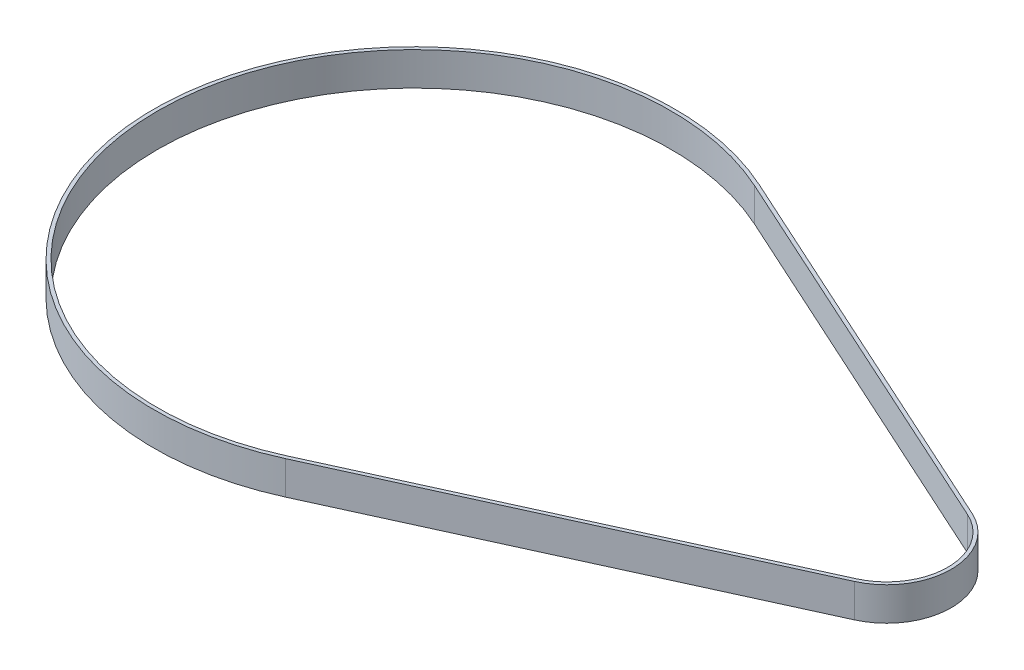
ISO-10303-21;
HEADER;
FILE_DESCRIPTION(('STEP AP214'),'2;1');
FILE_NAME('part.step','',(''),(''),'','','');
FILE_SCHEMA(('AUTOMOTIVE_DESIGN { 1 0 10303 214 1 1 1 1 }'));
ENDSEC;
DATA;
#1=APPLICATION_CONTEXT('core data for automotive mechanical design processes');
#2=APPLICATION_PROTOCOL_DEFINITION('international standard','automotive_design',2000,#1);
#3=PRODUCT_CONTEXT('',#1,'mechanical');
#4=PRODUCT('Part','Part','',(#3));
#5=PRODUCT_RELATED_PRODUCT_CATEGORY('part','',(#4));
#6=PRODUCT_DEFINITION_FORMATION('','',#4);
#7=PRODUCT_DEFINITION_CONTEXT('part definition',#1,'design');
#8=PRODUCT_DEFINITION('design','',#6,#7);
#9=PRODUCT_DEFINITION_SHAPE('','',#8);
#10=(LENGTH_UNIT() NAMED_UNIT(*) SI_UNIT(.MILLI.,.METRE.));
#11=(NAMED_UNIT(*) PLANE_ANGLE_UNIT() SI_UNIT($,.RADIAN.));
#12=(NAMED_UNIT(*) SI_UNIT($,.STERADIAN.) SOLID_ANGLE_UNIT());
#13=UNCERTAINTY_MEASURE_WITH_UNIT(LENGTH_MEASURE(1.E-05),#10,'distance_accuracy_value','');
#14=(GEOMETRIC_REPRESENTATION_CONTEXT(3) GLOBAL_UNCERTAINTY_ASSIGNED_CONTEXT((#13)) GLOBAL_UNIT_ASSIGNED_CONTEXT((#10,
#11,#12)) REPRESENTATION_CONTEXT('',''));
#15=CARTESIAN_POINT('',(0.,0.,0.));
#16=DIRECTION('',(0.,0.,1.));
#17=DIRECTION('',(1.,0.,0.));
#18=AXIS2_PLACEMENT_3D('',#15,#16,#17);
#19=CARTESIAN_POINT('',(0.,3.,0.));
#20=DIRECTION('',(0.,1.,0.));
#21=DIRECTION('',(0.,0.,1.));
#22=AXIS2_PLACEMENT_3D('',#19,#20,#21);
#23=PLANE('',#22);
#24=CARTESIAN_POINT('',(0.,3.,0.));
#25=DIRECTION('',(0.,1.,0.));
#26=DIRECTION('',(0.,0.,1.));
#27=AXIS2_PLACEMENT_3D('',#24,#25,#26);
#28=CIRCLE('',#27,46.88);
#29=CARTESIAN_POINT('',(19.4414117647059,3.,-42.6587143335937));
#30=VERTEX_POINT('',#29);
#31=CARTESIAN_POINT('',(19.4414117647059,3.,42.6587143335937));
#32=VERTEX_POINT('',#31);
#33=EDGE_CURVE('E138',#30,#32,#28,.T.);
#34=ORIENTED_EDGE('',*,*,#33,.T.);
#35=DIRECTION('',(0.909955510528877,0.,-0.414705882352941));
#36=VECTOR('',#35,1.);
#37=CARTESIAN_POINT('',(19.4414117647059,3.,42.6587143335937));
#38=LINE('',#37,#36);
#39=CARTESIAN_POINT('',(89.8230294117647,3.,10.5827825874508));
#40=VERTEX_POINT('',#39);
#41=EDGE_CURVE('E141',#32,#40,#38,.T.);
#42=ORIENTED_EDGE('',*,*,#41,.T.);
#43=CARTESIAN_POINT('',(85.,3.,0.));
#44=DIRECTION('',(0.,1.,0.));
#45=DIRECTION('',(0.,0.,1.));
#46=AXIS2_PLACEMENT_3D('',#43,#44,#45);
#47=CIRCLE('',#46,11.63);
#48=CARTESIAN_POINT('',(89.8230294117647,3.,-10.5827825874508));
#49=VERTEX_POINT('',#48);
#50=EDGE_CURVE('E144',#40,#49,#47,.T.);
#51=ORIENTED_EDGE('',*,*,#50,.T.);
#52=DIRECTION('',(-0.909955510528877,0.,-0.414705882352941));
#53=VECTOR('',#52,1.);
#54=CARTESIAN_POINT('',(89.8230294117647,3.,-10.5827825874508));
#55=LINE('',#54,#53);
#56=EDGE_CURVE('E146',#49,#30,#55,.T.);
#57=ORIENTED_EDGE('',*,*,#56,.T.);
#58=EDGE_LOOP('',(#34,#42,#51,#57));
#59=FACE_BOUND('',#58,.T.);
#60=DIRECTION('',(-0.909955510528877,0.,-0.414705882352941));
#61=VECTOR('',#60,1.);
#62=CARTESIAN_POINT('',(89.5617647058824,3.,-10.0095106158176));
#63=LINE('',#62,#61);
#64=CARTESIAN_POINT('',(89.5617647058824,3.,-10.0095106158176));
#65=VERTEX_POINT('',#64);
#66=CARTESIAN_POINT('',(19.1801470588235,3.,-42.0854423619605));
#67=VERTEX_POINT('',#66);
#68=EDGE_CURVE('E110',#65,#67,#63,.T.);
#69=ORIENTED_EDGE('',*,*,#68,.F.);
#70=CARTESIAN_POINT('',(85.,3.,0.));
#71=DIRECTION('',(0.,1.,0.));
#72=DIRECTION('',(0.,0.,1.));
#73=AXIS2_PLACEMENT_3D('',#70,#71,#72);
#74=CIRCLE('',#73,11.);
#75=CARTESIAN_POINT('',(89.5617647058824,3.,10.0095106158176));
#76=VERTEX_POINT('',#75);
#77=EDGE_CURVE('E102',#76,#65,#74,.T.);
#78=ORIENTED_EDGE('',*,*,#77,.F.);
#79=DIRECTION('',(0.909955510528877,0.,-0.414705882352941));
#80=VECTOR('',#79,1.);
#81=CARTESIAN_POINT('',(19.1801470588235,3.,42.0854423619605));
#82=LINE('',#81,#80);
#83=CARTESIAN_POINT('',(19.1801470588235,3.,42.0854423619605));
#84=VERTEX_POINT('',#83);
#85=EDGE_CURVE('E124',#84,#76,#82,.T.);
#86=ORIENTED_EDGE('',*,*,#85,.F.);
#87=CARTESIAN_POINT('',(0.,3.,0.));
#88=DIRECTION('',(0.,1.,0.));
#89=DIRECTION('',(0.,0.,1.));
#90=AXIS2_PLACEMENT_3D('',#87,#88,#89);
#91=CIRCLE('',#90,46.25);
#92=EDGE_CURVE('E122',#67,#84,#91,.T.);
#93=ORIENTED_EDGE('',*,*,#92,.F.);
#94=EDGE_LOOP('',(#69,#78,#86,#93));
#95=FACE_BOUND('',#94,.T.);
#96=ADVANCED_FACE('F37',(#59,#95),#23,.T.);
#97=CARTESIAN_POINT('',(0.,-3.,0.));
#98=DIRECTION('',(0.,1.,0.));
#99=DIRECTION('',(0.,0.,1.));
#100=AXIS2_PLACEMENT_3D('',#97,#98,#99);
#101=PLANE('',#100);
#102=CARTESIAN_POINT('',(0.,-3.,0.));
#103=DIRECTION('',(0.,1.,0.));
#104=DIRECTION('',(0.,0.,1.));
#105=AXIS2_PLACEMENT_3D('',#102,#103,#104);
#106=CIRCLE('',#105,46.88);
#107=CARTESIAN_POINT('',(19.4414117647059,-3.,-42.6587143335937));
#108=VERTEX_POINT('',#107);
#109=CARTESIAN_POINT('',(19.4414117647059,-3.,42.6587143335937));
#110=VERTEX_POINT('',#109);
#111=EDGE_CURVE('E118',#108,#110,#106,.T.);
#112=ORIENTED_EDGE('',*,*,#111,.F.);
#113=DIRECTION('',(-0.909955510528877,0.,-0.414705882352941));
#114=VECTOR('',#113,1.);
#115=CARTESIAN_POINT('',(89.8230294117647,-3.,-10.5827825874508));
#116=LINE('',#115,#114);
#117=CARTESIAN_POINT('',(89.8230294117647,-3.,-10.5827825874508));
#118=VERTEX_POINT('',#117);
#119=EDGE_CURVE('E142',#118,#108,#116,.T.);
#120=ORIENTED_EDGE('',*,*,#119,.F.);
#121=CARTESIAN_POINT('',(85.,-3.,0.));
#122=DIRECTION('',(0.,1.,0.));
#123=DIRECTION('',(0.,0.,1.));
#124=AXIS2_PLACEMENT_3D('',#121,#122,#123);
#125=CIRCLE('',#124,11.63);
#126=CARTESIAN_POINT('',(89.8230294117647,-3.,10.5827825874508));
#127=VERTEX_POINT('',#126);
#128=EDGE_CURVE('E153',#127,#118,#125,.T.);
#129=ORIENTED_EDGE('',*,*,#128,.F.);
#130=DIRECTION('',(0.909955510528877,0.,-0.414705882352941));
#131=VECTOR('',#130,1.);
#132=CARTESIAN_POINT('',(19.4414117647059,-3.,42.6587143335937));
#133=LINE('',#132,#131);
#134=EDGE_CURVE('E151',#110,#127,#133,.T.);
#135=ORIENTED_EDGE('',*,*,#134,.F.);
#136=EDGE_LOOP('',(#112,#120,#129,#135));
#137=FACE_BOUND('',#136,.T.);
#138=CARTESIAN_POINT('',(85.,-3.,0.));
#139=DIRECTION('',(0.,1.,0.));
#140=DIRECTION('',(0.,0.,1.));
#141=AXIS2_PLACEMENT_3D('',#138,#139,#140);
#142=CIRCLE('',#141,11.);
#143=CARTESIAN_POINT('',(89.5617647058824,-3.,10.0095106158176));
#144=VERTEX_POINT('',#143);
#145=CARTESIAN_POINT('',(89.5617647058824,-3.,-10.0095106158176));
#146=VERTEX_POINT('',#145);
#147=EDGE_CURVE('E60',#144,#146,#142,.T.);
#148=ORIENTED_EDGE('',*,*,#147,.T.);
#149=DIRECTION('',(-0.909955510528877,0.,-0.414705882352941));
#150=VECTOR('',#149,1.);
#151=CARTESIAN_POINT('',(89.5617647058824,-3.,-10.0095106158176));
#152=LINE('',#151,#150);
#153=CARTESIAN_POINT('',(19.1801470588235,-3.,-42.0854423619605));
#154=VERTEX_POINT('',#153);
#155=EDGE_CURVE('E117',#146,#154,#152,.T.);
#156=ORIENTED_EDGE('',*,*,#155,.T.);
#157=CARTESIAN_POINT('',(0.,-3.,0.));
#158=DIRECTION('',(0.,1.,0.));
#159=DIRECTION('',(0.,0.,1.));
#160=AXIS2_PLACEMENT_3D('',#157,#158,#159);
#161=CIRCLE('',#160,46.25);
#162=CARTESIAN_POINT('',(19.1801470588235,-3.,42.0854423619605));
#163=VERTEX_POINT('',#162);
#164=EDGE_CURVE('E130',#154,#163,#161,.T.);
#165=ORIENTED_EDGE('',*,*,#164,.T.);
#166=DIRECTION('',(0.909955510528877,0.,-0.414705882352941));
#167=VECTOR('',#166,1.);
#168=CARTESIAN_POINT('',(19.1801470588235,-3.,42.0854423619605));
#169=LINE('',#168,#167);
#170=EDGE_CURVE('E111',#163,#144,#169,.T.);
#171=ORIENTED_EDGE('',*,*,#170,.T.);
#172=EDGE_LOOP('',(#148,#156,#165,#171));
#173=FACE_BOUND('',#172,.T.);
#174=ADVANCED_FACE('F171',(#137,#173),#101,.F.);
#175=CARTESIAN_POINT('',(0.,3.,0.));
#176=DIRECTION('',(0.,-1.,0.));
#177=DIRECTION('',(0.,0.,-1.));
#178=AXIS2_PLACEMENT_3D('',#175,#176,#177);
#179=CYLINDRICAL_SURFACE('',#178,46.88);
#180=ORIENTED_EDGE('',*,*,#111,.T.);
#181=DIRECTION('',(0.,-1.,0.));
#182=VECTOR('',#181,1.);
#183=CARTESIAN_POINT('',(19.4414117647059,3.,42.6587143335937));
#184=LINE('',#183,#182);
#185=EDGE_CURVE('E11',#32,#110,#184,.T.);
#186=ORIENTED_EDGE('',*,*,#185,.F.);
#187=ORIENTED_EDGE('',*,*,#33,.F.);
#188=DIRECTION('',(0.,-1.,0.));
#189=VECTOR('',#188,1.);
#190=CARTESIAN_POINT('',(19.4414117647059,3.,-42.6587143335937));
#191=LINE('',#190,#189);
#192=EDGE_CURVE('E148',#30,#108,#191,.T.);
#193=ORIENTED_EDGE('',*,*,#192,.T.);
#194=EDGE_LOOP('',(#180,#186,#187,#193));
#195=FACE_BOUND('',#194,.T.);
#196=ADVANCED_FACE('F39',(#195),#179,.T.);
#197=CARTESIAN_POINT('',(19.4414117647059,3.,42.6587143335937));
#198=DIRECTION('',(-0.414705882352941,0.,-0.909955510528877));
#199=DIRECTION('',(-0.909955510528877,0.,0.414705882352941));
#200=AXIS2_PLACEMENT_3D('',#197,#198,#199);
#201=PLANE('',#200);
#202=ORIENTED_EDGE('',*,*,#134,.T.);
#203=DIRECTION('',(0.,-1.,0.));
#204=VECTOR('',#203,1.);
#205=CARTESIAN_POINT('',(89.8230294117647,3.,10.5827825874508));
#206=LINE('',#205,#204);
#207=EDGE_CURVE('E45',#40,#127,#206,.T.);
#208=ORIENTED_EDGE('',*,*,#207,.F.);
#209=ORIENTED_EDGE('',*,*,#41,.F.);
#210=ORIENTED_EDGE('',*,*,#185,.T.);
#211=EDGE_LOOP('',(#202,#208,#209,#210));
#212=FACE_BOUND('',#211,.T.);
#213=ADVANCED_FACE('F181',(#212),#201,.F.);
#214=CARTESIAN_POINT('',(85.,3.,0.));
#215=DIRECTION('',(0.,-1.,0.));
#216=DIRECTION('',(0.,0.,-1.));
#217=AXIS2_PLACEMENT_3D('',#214,#215,#216);
#218=CYLINDRICAL_SURFACE('',#217,11.63);
#219=ORIENTED_EDGE('',*,*,#128,.T.);
#220=DIRECTION('',(0.,-1.,0.));
#221=VECTOR('',#220,1.);
#222=CARTESIAN_POINT('',(89.8230294117647,3.,-10.5827825874508));
#223=LINE('',#222,#221);
#224=EDGE_CURVE('E158',#49,#118,#223,.T.);
#225=ORIENTED_EDGE('',*,*,#224,.F.);
#226=ORIENTED_EDGE('',*,*,#50,.F.);
#227=ORIENTED_EDGE('',*,*,#207,.T.);
#228=EDGE_LOOP('',(#219,#225,#226,#227));
#229=FACE_BOUND('',#228,.T.);
#230=ADVANCED_FACE('F165',(#229),#218,.T.);
#231=CARTESIAN_POINT('',(89.8230294117647,3.,-10.5827825874508));
#232=DIRECTION('',(-0.414705882352941,0.,0.909955510528877));
#233=DIRECTION('',(0.909955510528877,0.,0.414705882352941));
#234=AXIS2_PLACEMENT_3D('',#231,#232,#233);
#235=PLANE('',#234);
#236=ORIENTED_EDGE('',*,*,#119,.T.);
#237=ORIENTED_EDGE('',*,*,#192,.F.);
#238=ORIENTED_EDGE('',*,*,#56,.F.);
#239=ORIENTED_EDGE('',*,*,#224,.T.);
#240=EDGE_LOOP('',(#236,#237,#238,#239));
#241=FACE_BOUND('',#240,.T.);
#242=ADVANCED_FACE('F175',(#241),#235,.F.);
#243=CARTESIAN_POINT('',(85.,3.,0.));
#244=DIRECTION('',(0.,-1.,0.));
#245=DIRECTION('',(0.,0.,-1.));
#246=AXIS2_PLACEMENT_3D('',#243,#244,#245);
#247=CYLINDRICAL_SURFACE('',#246,11.);
#248=ORIENTED_EDGE('',*,*,#147,.F.);
#249=DIRECTION('',(0.,-1.,0.));
#250=VECTOR('',#249,1.);
#251=CARTESIAN_POINT('',(89.5617647058824,3.,10.0095106158176));
#252=LINE('',#251,#250);
#253=EDGE_CURVE('E106',#76,#144,#252,.T.);
#254=ORIENTED_EDGE('',*,*,#253,.F.);
#255=ORIENTED_EDGE('',*,*,#77,.T.);
#256=DIRECTION('',(0.,-1.,0.));
#257=VECTOR('',#256,1.);
#258=CARTESIAN_POINT('',(89.5617647058824,3.,-10.0095106158176));
#259=LINE('',#258,#257);
#260=EDGE_CURVE('E105',#65,#146,#259,.T.);
#261=ORIENTED_EDGE('',*,*,#260,.T.);
#262=EDGE_LOOP('',(#248,#254,#255,#261));
#263=FACE_BOUND('',#262,.T.);
#264=ADVANCED_FACE('F104',(#263),#247,.F.);
#265=CARTESIAN_POINT('',(89.5617647058824,3.,-10.0095106158176));
#266=DIRECTION('',(-0.414705882352941,0.,0.909955510528877));
#267=DIRECTION('',(0.909955510528877,0.,0.414705882352941));
#268=AXIS2_PLACEMENT_3D('',#265,#266,#267);
#269=PLANE('',#268);
#270=ORIENTED_EDGE('',*,*,#155,.F.);
#271=ORIENTED_EDGE('',*,*,#260,.F.);
#272=ORIENTED_EDGE('',*,*,#68,.T.);
#273=DIRECTION('',(0.,-1.,0.));
#274=VECTOR('',#273,1.);
#275=CARTESIAN_POINT('',(19.1801470588235,3.,-42.0854423619605));
#276=LINE('',#275,#274);
#277=EDGE_CURVE('E119',#67,#154,#276,.T.);
#278=ORIENTED_EDGE('',*,*,#277,.T.);
#279=EDGE_LOOP('',(#270,#271,#272,#278));
#280=FACE_BOUND('',#279,.T.);
#281=ADVANCED_FACE('F114',(#280),#269,.T.);
#282=CARTESIAN_POINT('',(0.,3.,0.));
#283=DIRECTION('',(0.,-1.,0.));
#284=DIRECTION('',(0.,0.,-1.));
#285=AXIS2_PLACEMENT_3D('',#282,#283,#284);
#286=CYLINDRICAL_SURFACE('',#285,46.25);
#287=ORIENTED_EDGE('',*,*,#164,.F.);
#288=ORIENTED_EDGE('',*,*,#277,.F.);
#289=ORIENTED_EDGE('',*,*,#92,.T.);
#290=DIRECTION('',(0.,-1.,0.));
#291=VECTOR('',#290,1.);
#292=CARTESIAN_POINT('',(19.1801470588235,3.,42.0854423619605));
#293=LINE('',#292,#291);
#294=EDGE_CURVE('E52',#84,#163,#293,.T.);
#295=ORIENTED_EDGE('',*,*,#294,.T.);
#296=EDGE_LOOP('',(#287,#288,#289,#295));
#297=FACE_BOUND('',#296,.T.);
#298=ADVANCED_FACE('F204',(#297),#286,.F.);
#299=CARTESIAN_POINT('',(19.1801470588235,3.,42.0854423619605));
#300=DIRECTION('',(-0.414705882352941,0.,-0.909955510528877));
#301=DIRECTION('',(-0.909955510528877,0.,0.414705882352941));
#302=AXIS2_PLACEMENT_3D('',#299,#300,#301);
#303=PLANE('',#302);
#304=ORIENTED_EDGE('',*,*,#170,.F.);
#305=ORIENTED_EDGE('',*,*,#294,.F.);
#306=ORIENTED_EDGE('',*,*,#85,.T.);
#307=ORIENTED_EDGE('',*,*,#253,.T.);
#308=EDGE_LOOP('',(#304,#305,#306,#307));
#309=FACE_BOUND('',#308,.T.);
#310=ADVANCED_FACE('F208',(#309),#303,.T.);
#311=CLOSED_SHELL('',(#96,#174,#196,#213,#230,#242,#264,#281,#298,#310));
#312=MANIFOLD_SOLID_BREP('B2',#311);
#313=ADVANCED_BREP_SHAPE_REPRESENTATION('',(#18,#312),#14);
#314=SHAPE_DEFINITION_REPRESENTATION(#9,#313);
ENDSEC;
END-ISO-10303-21;
